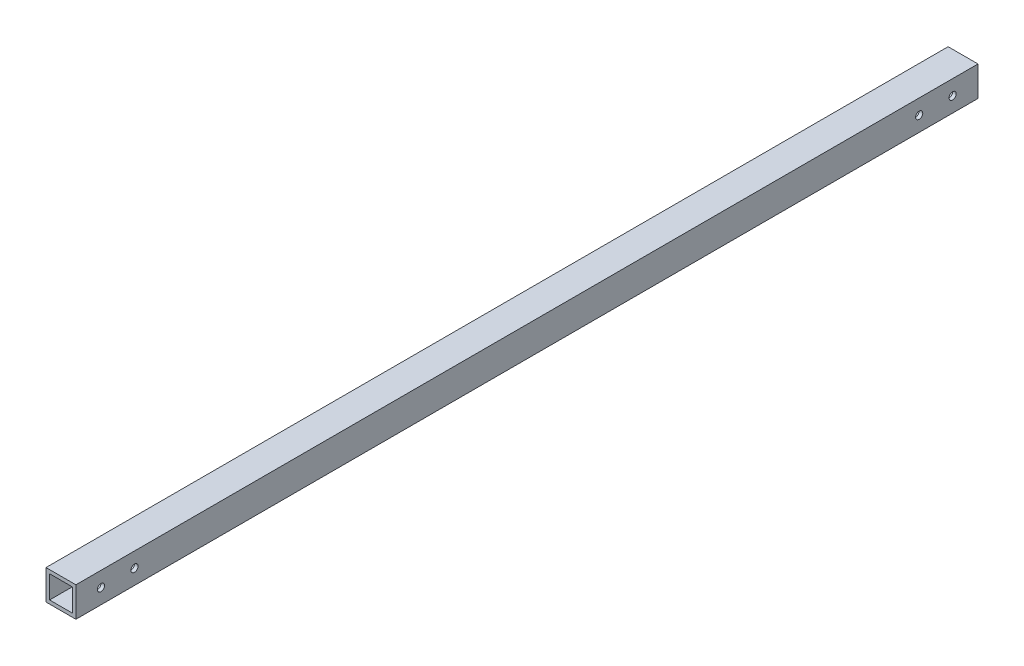
ISO-10303-21;
HEADER;
FILE_DESCRIPTION(('STEP AP214'),'2;1');
FILE_NAME('part.step','',(''),(''),'','','');
FILE_SCHEMA(('AUTOMOTIVE_DESIGN { 1 0 10303 214 1 1 1 1 }'));
ENDSEC;
DATA;
#1=APPLICATION_CONTEXT('core data for automotive mechanical design processes');
#2=APPLICATION_PROTOCOL_DEFINITION('international standard','automotive_design',2000,#1);
#3=PRODUCT_CONTEXT('',#1,'mechanical');
#4=PRODUCT('Part','Part','',(#3));
#5=PRODUCT_RELATED_PRODUCT_CATEGORY('part','',(#4));
#6=PRODUCT_DEFINITION_FORMATION('','',#4);
#7=PRODUCT_DEFINITION_CONTEXT('part definition',#1,'design');
#8=PRODUCT_DEFINITION('design','',#6,#7);
#9=PRODUCT_DEFINITION_SHAPE('','',#8);
#10=(LENGTH_UNIT() NAMED_UNIT(*) SI_UNIT(.MILLI.,.METRE.));
#11=(NAMED_UNIT(*) PLANE_ANGLE_UNIT() SI_UNIT($,.RADIAN.));
#12=(NAMED_UNIT(*) SI_UNIT($,.STERADIAN.) SOLID_ANGLE_UNIT());
#13=UNCERTAINTY_MEASURE_WITH_UNIT(LENGTH_MEASURE(1.E-05),#10,'distance_accuracy_value','');
#14=(GEOMETRIC_REPRESENTATION_CONTEXT(3) GLOBAL_UNCERTAINTY_ASSIGNED_CONTEXT((#13)) GLOBAL_UNIT_ASSIGNED_CONTEXT((#10,
#11,#12)) REPRESENTATION_CONTEXT('',''));
#15=CARTESIAN_POINT('',(0.,0.,0.));
#16=DIRECTION('',(0.,0.,1.));
#17=DIRECTION('',(1.,0.,0.));
#18=AXIS2_PLACEMENT_3D('',#15,#16,#17);
#19=CARTESIAN_POINT('',(0.,-25.,754.5));
#20=DIRECTION('',(0.,0.,1.));
#21=DIRECTION('',(1.,0.,0.));
#22=AXIS2_PLACEMENT_3D('',#19,#20,#21);
#23=PLANE('',#22);
#24=DIRECTION('',(0.,-1.,0.));
#25=VECTOR('',#24,1.);
#26=CARTESIAN_POINT('',(0.,0.,754.5));
#27=LINE('',#26,#25);
#28=CARTESIAN_POINT('',(0.,0.,754.5));
#29=VERTEX_POINT('',#28);
#30=CARTESIAN_POINT('',(0.,-25.,754.5));
#31=VERTEX_POINT('',#30);
#32=EDGE_CURVE('E137',#29,#31,#27,.T.);
#33=ORIENTED_EDGE('',*,*,#32,.T.);
#34=DIRECTION('',(1.,0.,0.));
#35=VECTOR('',#34,1.);
#36=CARTESIAN_POINT('',(0.,-25.,754.5));
#37=LINE('',#36,#35);
#38=CARTESIAN_POINT('',(25.,-25.,754.5));
#39=VERTEX_POINT('',#38);
#40=EDGE_CURVE('E140',#31,#39,#37,.T.);
#41=ORIENTED_EDGE('',*,*,#40,.T.);
#42=DIRECTION('',(0.,1.,0.));
#43=VECTOR('',#42,1.);
#44=CARTESIAN_POINT('',(25.,0.,754.5));
#45=LINE('',#44,#43);
#46=CARTESIAN_POINT('',(25.,0.,754.5));
#47=VERTEX_POINT('',#46);
#48=EDGE_CURVE('E143',#39,#47,#45,.T.);
#49=ORIENTED_EDGE('',*,*,#48,.T.);
#50=DIRECTION('',(-1.,0.,0.));
#51=VECTOR('',#50,1.);
#52=CARTESIAN_POINT('',(0.,0.,754.5));
#53=LINE('',#52,#51);
#54=EDGE_CURVE('E145',#47,#29,#53,.T.);
#55=ORIENTED_EDGE('',*,*,#54,.T.);
#56=EDGE_LOOP('',(#33,#41,#49,#55));
#57=FACE_BOUND('',#56,.T.);
#58=DIRECTION('',(1.,0.,0.));
#59=VECTOR('',#58,1.);
#60=CARTESIAN_POINT('',(3.,-22.,754.5));
#61=LINE('',#60,#59);
#62=CARTESIAN_POINT('',(3.,-22.,754.5));
#63=VERTEX_POINT('',#62);
#64=CARTESIAN_POINT('',(22.,-22.,754.5));
#65=VERTEX_POINT('',#64);
#66=EDGE_CURVE('E107',#63,#65,#61,.T.);
#67=ORIENTED_EDGE('',*,*,#66,.F.);
#68=DIRECTION('',(0.,-1.,0.));
#69=VECTOR('',#68,1.);
#70=CARTESIAN_POINT('',(3.,-3.,754.5));
#71=LINE('',#70,#69);
#72=CARTESIAN_POINT('',(3.,-3.,754.5));
#73=VERTEX_POINT('',#72);
#74=EDGE_CURVE('E99',#73,#63,#71,.T.);
#75=ORIENTED_EDGE('',*,*,#74,.F.);
#76=DIRECTION('',(-1.,0.,0.));
#77=VECTOR('',#76,1.);
#78=CARTESIAN_POINT('',(3.,-3.,754.5));
#79=LINE('',#78,#77);
#80=CARTESIAN_POINT('',(22.,-3.,754.5));
#81=VERTEX_POINT('',#80);
#82=EDGE_CURVE('E121',#81,#73,#79,.T.);
#83=ORIENTED_EDGE('',*,*,#82,.F.);
#84=DIRECTION('',(0.,1.,0.));
#85=VECTOR('',#84,1.);
#86=CARTESIAN_POINT('',(22.,-3.,754.5));
#87=LINE('',#86,#85);
#88=EDGE_CURVE('E119',#65,#81,#87,.T.);
#89=ORIENTED_EDGE('',*,*,#88,.F.);
#90=EDGE_LOOP('',(#67,#75,#83,#89));
#91=FACE_BOUND('',#90,.T.);
#92=ADVANCED_FACE('F32',(#57,#91),#23,.T.);
#93=CARTESIAN_POINT('',(0.,-25.,0.));
#94=DIRECTION('',(0.,0.,1.));
#95=DIRECTION('',(1.,0.,0.));
#96=AXIS2_PLACEMENT_3D('',#93,#94,#95);
#97=PLANE('',#96);
#98=DIRECTION('',(0.,-1.,0.));
#99=VECTOR('',#98,1.);
#100=CARTESIAN_POINT('',(0.,0.,0.));
#101=LINE('',#100,#99);
#102=CARTESIAN_POINT('',(0.,0.,0.));
#103=VERTEX_POINT('',#102);
#104=CARTESIAN_POINT('',(0.,-25.,0.));
#105=VERTEX_POINT('',#104);
#106=EDGE_CURVE('E115',#103,#105,#101,.T.);
#107=ORIENTED_EDGE('',*,*,#106,.F.);
#108=DIRECTION('',(-1.,0.,0.));
#109=VECTOR('',#108,1.);
#110=CARTESIAN_POINT('',(0.,0.,0.));
#111=LINE('',#110,#109);
#112=CARTESIAN_POINT('',(25.,0.,0.));
#113=VERTEX_POINT('',#112);
#114=EDGE_CURVE('E141',#113,#103,#111,.T.);
#115=ORIENTED_EDGE('',*,*,#114,.F.);
#116=DIRECTION('',(0.,1.,0.));
#117=VECTOR('',#116,1.);
#118=CARTESIAN_POINT('',(25.,0.,0.));
#119=LINE('',#118,#117);
#120=CARTESIAN_POINT('',(25.,-25.,0.));
#121=VERTEX_POINT('',#120);
#122=EDGE_CURVE('E152',#121,#113,#119,.T.);
#123=ORIENTED_EDGE('',*,*,#122,.F.);
#124=DIRECTION('',(1.,0.,0.));
#125=VECTOR('',#124,1.);
#126=CARTESIAN_POINT('',(0.,-25.,0.));
#127=LINE('',#126,#125);
#128=EDGE_CURVE('E150',#105,#121,#127,.T.);
#129=ORIENTED_EDGE('',*,*,#128,.F.);
#130=EDGE_LOOP('',(#107,#115,#123,#129));
#131=FACE_BOUND('',#130,.T.);
#132=DIRECTION('',(0.,-1.,0.));
#133=VECTOR('',#132,1.);
#134=CARTESIAN_POINT('',(3.,-3.,0.));
#135=LINE('',#134,#133);
#136=CARTESIAN_POINT('',(3.,-3.,0.));
#137=VERTEX_POINT('',#136);
#138=CARTESIAN_POINT('',(3.,-22.,0.));
#139=VERTEX_POINT('',#138);
#140=EDGE_CURVE('E57',#137,#139,#135,.T.);
#141=ORIENTED_EDGE('',*,*,#140,.T.);
#142=DIRECTION('',(1.,0.,0.));
#143=VECTOR('',#142,1.);
#144=CARTESIAN_POINT('',(3.,-22.,0.));
#145=LINE('',#144,#143);
#146=CARTESIAN_POINT('',(22.,-22.,0.));
#147=VERTEX_POINT('',#146);
#148=EDGE_CURVE('E114',#139,#147,#145,.T.);
#149=ORIENTED_EDGE('',*,*,#148,.T.);
#150=DIRECTION('',(0.,1.,0.));
#151=VECTOR('',#150,1.);
#152=CARTESIAN_POINT('',(22.,-3.,0.));
#153=LINE('',#152,#151);
#154=CARTESIAN_POINT('',(22.,-3.,0.));
#155=VERTEX_POINT('',#154);
#156=EDGE_CURVE('E129',#147,#155,#153,.T.);
#157=ORIENTED_EDGE('',*,*,#156,.T.);
#158=DIRECTION('',(-1.,0.,0.));
#159=VECTOR('',#158,1.);
#160=CARTESIAN_POINT('',(3.,-3.,0.));
#161=LINE('',#160,#159);
#162=EDGE_CURVE('E108',#155,#137,#161,.T.);
#163=ORIENTED_EDGE('',*,*,#162,.T.);
#164=EDGE_LOOP('',(#141,#149,#157,#163));
#165=FACE_BOUND('',#164,.T.);
#166=ADVANCED_FACE('F222',(#131,#165),#97,.F.);
#167=CARTESIAN_POINT('',(0.,0.,754.5));
#168=DIRECTION('',(1.,0.,0.));
#169=DIRECTION('',(0.,1.,0.));
#170=AXIS2_PLACEMENT_3D('',#167,#168,#169);
#171=PLANE('',#170);
#172=CARTESIAN_POINT('',(0.,-12.5,49.2));
#173=DIRECTION('',(-1.,0.,0.));
#174=DIRECTION('',(0.,-1.,0.));
#175=AXIS2_PLACEMENT_3D('',#172,#173,#174);
#176=CIRCLE('',#175,5.99999999999999);
#177=CARTESIAN_POINT('',(0.,-18.5,49.2));
#178=VERTEX_POINT('',#177);
#179=EDGE_CURVE('E203',#178,#178,#176,.T.);
#180=ORIENTED_EDGE('',*,*,#179,.F.);
#181=EDGE_LOOP('',(#180));
#182=FACE_BOUND('',#181,.T.);
#183=CARTESIAN_POINT('',(0.,-12.5,21.2));
#184=DIRECTION('',(-1.,0.,0.));
#185=DIRECTION('',(0.,-1.,0.));
#186=AXIS2_PLACEMENT_3D('',#183,#184,#185);
#187=CIRCLE('',#186,5.99999999999999);
#188=CARTESIAN_POINT('',(0.,-18.5,21.2));
#189=VERTEX_POINT('',#188);
#190=EDGE_CURVE('E197',#189,#189,#187,.T.);
#191=ORIENTED_EDGE('',*,*,#190,.F.);
#192=EDGE_LOOP('',(#191));
#193=FACE_BOUND('',#192,.T.);
#194=CARTESIAN_POINT('',(0.,-12.5,733.5));
#195=DIRECTION('',(-1.,0.,0.));
#196=DIRECTION('',(0.,-1.,0.));
#197=AXIS2_PLACEMENT_3D('',#194,#195,#196);
#198=CIRCLE('',#197,5.99999999999999);
#199=CARTESIAN_POINT('',(0.,-18.5,733.5));
#200=VERTEX_POINT('',#199);
#201=EDGE_CURVE('E177',#200,#200,#198,.T.);
#202=ORIENTED_EDGE('',*,*,#201,.F.);
#203=EDGE_LOOP('',(#202));
#204=FACE_BOUND('',#203,.T.);
#205=CARTESIAN_POINT('',(0.,-12.5,705.5));
#206=DIRECTION('',(-1.,0.,0.));
#207=DIRECTION('',(0.,-1.,0.));
#208=AXIS2_PLACEMENT_3D('',#205,#206,#207);
#209=CIRCLE('',#208,5.99999999999999);
#210=CARTESIAN_POINT('',(0.,-18.5,705.5));
#211=VERTEX_POINT('',#210);
#212=EDGE_CURVE('E173',#211,#211,#209,.T.);
#213=ORIENTED_EDGE('',*,*,#212,.F.);
#214=EDGE_LOOP('',(#213));
#215=FACE_BOUND('',#214,.T.);
#216=ORIENTED_EDGE('',*,*,#106,.T.);
#217=DIRECTION('',(0.,0.,-1.));
#218=VECTOR('',#217,1.);
#219=CARTESIAN_POINT('',(0.,-25.,754.5));
#220=LINE('',#219,#218);
#221=EDGE_CURVE('E11',#31,#105,#220,.T.);
#222=ORIENTED_EDGE('',*,*,#221,.F.);
#223=ORIENTED_EDGE('',*,*,#32,.F.);
#224=DIRECTION('',(0.,0.,-1.));
#225=VECTOR('',#224,1.);
#226=CARTESIAN_POINT('',(0.,0.,754.5));
#227=LINE('',#226,#225);
#228=EDGE_CURVE('E147',#29,#103,#227,.T.);
#229=ORIENTED_EDGE('',*,*,#228,.T.);
#230=EDGE_LOOP('',(#216,#222,#223,#229));
#231=FACE_BOUND('',#230,.T.);
#232=ADVANCED_FACE('F34',(#182,#193,#204,#215,#231),#171,.F.);
#233=CARTESIAN_POINT('',(0.,-25.,754.5));
#234=DIRECTION('',(0.,1.,0.));
#235=DIRECTION('',(0.,0.,1.));
#236=AXIS2_PLACEMENT_3D('',#233,#234,#235);
#237=PLANE('',#236);
#238=ORIENTED_EDGE('',*,*,#128,.T.);
#239=DIRECTION('',(0.,0.,-1.));
#240=VECTOR('',#239,1.);
#241=CARTESIAN_POINT('',(25.,-25.,754.5));
#242=LINE('',#241,#240);
#243=EDGE_CURVE('E41',#39,#121,#242,.T.);
#244=ORIENTED_EDGE('',*,*,#243,.F.);
#245=ORIENTED_EDGE('',*,*,#40,.F.);
#246=ORIENTED_EDGE('',*,*,#221,.T.);
#247=EDGE_LOOP('',(#238,#244,#245,#246));
#248=FACE_BOUND('',#247,.T.);
#249=ADVANCED_FACE('F221',(#248),#237,.F.);
#250=CARTESIAN_POINT('',(25.,0.,754.5));
#251=DIRECTION('',(-1.,0.,0.));
#252=DIRECTION('',(0.,-1.,0.));
#253=AXIS2_PLACEMENT_3D('',#250,#251,#252);
#254=PLANE('',#253);
#255=CARTESIAN_POINT('',(25.,-12.5,49.2));
#256=DIRECTION('',(1.,0.,0.));
#257=DIRECTION('',(0.,0.,-1.));
#258=AXIS2_PLACEMENT_3D('',#255,#256,#257);
#259=CIRCLE('',#258,2.99999999999999);
#260=CARTESIAN_POINT('',(25.,-12.5,46.2));
#261=VERTEX_POINT('',#260);
#262=EDGE_CURVE('E191',#261,#261,#259,.T.);
#263=ORIENTED_EDGE('',*,*,#262,.F.);
#264=EDGE_LOOP('',(#263));
#265=FACE_BOUND('',#264,.T.);
#266=CARTESIAN_POINT('',(25.,-12.5,21.2));
#267=DIRECTION('',(1.,0.,0.));
#268=DIRECTION('',(0.,0.,-1.));
#269=AXIS2_PLACEMENT_3D('',#266,#267,#268);
#270=CIRCLE('',#269,2.99999999999999);
#271=CARTESIAN_POINT('',(25.,-12.5,18.2));
#272=VERTEX_POINT('',#271);
#273=EDGE_CURVE('E183',#272,#272,#270,.T.);
#274=ORIENTED_EDGE('',*,*,#273,.F.);
#275=EDGE_LOOP('',(#274));
#276=FACE_BOUND('',#275,.T.);
#277=CARTESIAN_POINT('',(25.,-12.5,705.5));
#278=DIRECTION('',(1.,0.,0.));
#279=DIRECTION('',(0.,0.,-1.));
#280=AXIS2_PLACEMENT_3D('',#277,#278,#279);
#281=CIRCLE('',#280,2.99999999999999);
#282=CARTESIAN_POINT('',(25.,-12.5,702.5));
#283=VERTEX_POINT('',#282);
#284=EDGE_CURVE('E169',#283,#283,#281,.T.);
#285=ORIENTED_EDGE('',*,*,#284,.F.);
#286=EDGE_LOOP('',(#285));
#287=FACE_BOUND('',#286,.T.);
#288=CARTESIAN_POINT('',(25.,-12.5,733.5));
#289=DIRECTION('',(1.,0.,0.));
#290=DIRECTION('',(0.,0.,-1.));
#291=AXIS2_PLACEMENT_3D('',#288,#289,#290);
#292=CIRCLE('',#291,2.99999999999999);
#293=CARTESIAN_POINT('',(25.,-12.5,730.5));
#294=VERTEX_POINT('',#293);
#295=EDGE_CURVE('E162',#294,#294,#292,.T.);
#296=ORIENTED_EDGE('',*,*,#295,.F.);
#297=EDGE_LOOP('',(#296));
#298=FACE_BOUND('',#297,.T.);
#299=ORIENTED_EDGE('',*,*,#122,.T.);
#300=DIRECTION('',(0.,0.,-1.));
#301=VECTOR('',#300,1.);
#302=CARTESIAN_POINT('',(25.,0.,754.5));
#303=LINE('',#302,#301);
#304=EDGE_CURVE('E157',#47,#113,#303,.T.);
#305=ORIENTED_EDGE('',*,*,#304,.F.);
#306=ORIENTED_EDGE('',*,*,#48,.F.);
#307=ORIENTED_EDGE('',*,*,#243,.T.);
#308=EDGE_LOOP('',(#299,#305,#306,#307));
#309=FACE_BOUND('',#308,.T.);
#310=ADVANCED_FACE('F246',(#265,#276,#287,#298,#309),#254,.F.);
#311=CARTESIAN_POINT('',(0.,0.,754.5));
#312=DIRECTION('',(0.,-1.,0.));
#313=DIRECTION('',(0.,0.,-1.));
#314=AXIS2_PLACEMENT_3D('',#311,#312,#313);
#315=PLANE('',#314);
#316=ORIENTED_EDGE('',*,*,#114,.T.);
#317=ORIENTED_EDGE('',*,*,#228,.F.);
#318=ORIENTED_EDGE('',*,*,#54,.F.);
#319=ORIENTED_EDGE('',*,*,#304,.T.);
#320=EDGE_LOOP('',(#316,#317,#318,#319));
#321=FACE_BOUND('',#320,.T.);
#322=ADVANCED_FACE('F244',(#321),#315,.F.);
#323=CARTESIAN_POINT('',(3.,-3.,754.5));
#324=DIRECTION('',(1.,0.,0.));
#325=DIRECTION('',(0.,1.,0.));
#326=AXIS2_PLACEMENT_3D('',#323,#324,#325);
#327=PLANE('',#326);
#328=CARTESIAN_POINT('',(3.,-12.5,49.2));
#329=DIRECTION('',(1.,0.,0.));
#330=DIRECTION('',(0.,1.,0.));
#331=AXIS2_PLACEMENT_3D('',#328,#329,#330);
#332=CIRCLE('',#331,5.99999999999999);
#333=CARTESIAN_POINT('',(3.,-6.50000000000001,49.2));
#334=VERTEX_POINT('',#333);
#335=EDGE_CURVE('E206',#334,#334,#332,.F.);
#336=ORIENTED_EDGE('',*,*,#335,.T.);
#337=EDGE_LOOP('',(#336));
#338=FACE_BOUND('',#337,.T.);
#339=CARTESIAN_POINT('',(3.,-12.5,21.2));
#340=DIRECTION('',(1.,0.,0.));
#341=DIRECTION('',(0.,1.,0.));
#342=AXIS2_PLACEMENT_3D('',#339,#340,#341);
#343=CIRCLE('',#342,5.99999999999999);
#344=CARTESIAN_POINT('',(3.,-6.50000000000001,21.2));
#345=VERTEX_POINT('',#344);
#346=EDGE_CURVE('E200',#345,#345,#343,.F.);
#347=ORIENTED_EDGE('',*,*,#346,.T.);
#348=EDGE_LOOP('',(#347));
#349=FACE_BOUND('',#348,.T.);
#350=CARTESIAN_POINT('',(3.,-12.5,733.5));
#351=DIRECTION('',(1.,0.,0.));
#352=DIRECTION('',(0.,1.,0.));
#353=AXIS2_PLACEMENT_3D('',#350,#351,#352);
#354=CIRCLE('',#353,5.99999999999999);
#355=CARTESIAN_POINT('',(3.,-6.50000000000001,733.5));
#356=VERTEX_POINT('',#355);
#357=EDGE_CURVE('E180',#356,#356,#354,.F.);
#358=ORIENTED_EDGE('',*,*,#357,.T.);
#359=EDGE_LOOP('',(#358));
#360=FACE_BOUND('',#359,.T.);
#361=CARTESIAN_POINT('',(3.,-12.5,705.5));
#362=DIRECTION('',(1.,0.,0.));
#363=DIRECTION('',(0.,1.,0.));
#364=AXIS2_PLACEMENT_3D('',#361,#362,#363);
#365=CIRCLE('',#364,5.99999999999999);
#366=CARTESIAN_POINT('',(3.,-6.50000000000001,705.5));
#367=VERTEX_POINT('',#366);
#368=EDGE_CURVE('E174',#367,#367,#365,.F.);
#369=ORIENTED_EDGE('',*,*,#368,.T.);
#370=EDGE_LOOP('',(#369));
#371=FACE_BOUND('',#370,.T.);
#372=ORIENTED_EDGE('',*,*,#140,.F.);
#373=DIRECTION('',(0.,0.,-1.));
#374=VECTOR('',#373,1.);
#375=CARTESIAN_POINT('',(3.,-3.,754.5));
#376=LINE('',#375,#374);
#377=EDGE_CURVE('E103',#73,#137,#376,.T.);
#378=ORIENTED_EDGE('',*,*,#377,.F.);
#379=ORIENTED_EDGE('',*,*,#74,.T.);
#380=DIRECTION('',(0.,0.,-1.));
#381=VECTOR('',#380,1.);
#382=CARTESIAN_POINT('',(3.,-22.,754.5));
#383=LINE('',#382,#381);
#384=EDGE_CURVE('E102',#63,#139,#383,.T.);
#385=ORIENTED_EDGE('',*,*,#384,.T.);
#386=EDGE_LOOP('',(#372,#378,#379,#385));
#387=FACE_BOUND('',#386,.T.);
#388=ADVANCED_FACE('F101',(#338,#349,#360,#371,#387),#327,.T.);
#389=CARTESIAN_POINT('',(3.,-22.,754.5));
#390=DIRECTION('',(0.,1.,0.));
#391=DIRECTION('',(0.,0.,1.));
#392=AXIS2_PLACEMENT_3D('',#389,#390,#391);
#393=PLANE('',#392);
#394=ORIENTED_EDGE('',*,*,#148,.F.);
#395=ORIENTED_EDGE('',*,*,#384,.F.);
#396=ORIENTED_EDGE('',*,*,#66,.T.);
#397=DIRECTION('',(0.,0.,-1.));
#398=VECTOR('',#397,1.);
#399=CARTESIAN_POINT('',(22.,-22.,754.5));
#400=LINE('',#399,#398);
#401=EDGE_CURVE('E116',#65,#147,#400,.T.);
#402=ORIENTED_EDGE('',*,*,#401,.T.);
#403=EDGE_LOOP('',(#394,#395,#396,#402));
#404=FACE_BOUND('',#403,.T.);
#405=ADVANCED_FACE('F111',(#404),#393,.T.);
#406=CARTESIAN_POINT('',(22.,-3.,754.5));
#407=DIRECTION('',(-1.,0.,0.));
#408=DIRECTION('',(0.,-1.,0.));
#409=AXIS2_PLACEMENT_3D('',#406,#407,#408);
#410=PLANE('',#409);
#411=CARTESIAN_POINT('',(22.,-12.5,49.2));
#412=DIRECTION('',(-1.,0.,0.));
#413=DIRECTION('',(0.,-1.,0.));
#414=AXIS2_PLACEMENT_3D('',#411,#412,#413);
#415=CIRCLE('',#414,2.99999999999999);
#416=CARTESIAN_POINT('',(22.,-15.5,49.2));
#417=VERTEX_POINT('',#416);
#418=EDGE_CURVE('E194',#417,#417,#415,.T.);
#419=ORIENTED_EDGE('',*,*,#418,.F.);
#420=EDGE_LOOP('',(#419));
#421=FACE_BOUND('',#420,.T.);
#422=CARTESIAN_POINT('',(22.,-12.5,21.2));
#423=DIRECTION('',(-1.,0.,0.));
#424=DIRECTION('',(0.,-1.,0.));
#425=AXIS2_PLACEMENT_3D('',#422,#423,#424);
#426=CIRCLE('',#425,2.99999999999999);
#427=CARTESIAN_POINT('',(22.,-15.5,21.2));
#428=VERTEX_POINT('',#427);
#429=EDGE_CURVE('E188',#428,#428,#426,.T.);
#430=ORIENTED_EDGE('',*,*,#429,.F.);
#431=EDGE_LOOP('',(#430));
#432=FACE_BOUND('',#431,.T.);
#433=CARTESIAN_POINT('',(22.,-12.5,705.5));
#434=DIRECTION('',(-1.,0.,0.));
#435=DIRECTION('',(0.,-1.,0.));
#436=AXIS2_PLACEMENT_3D('',#433,#434,#435);
#437=CIRCLE('',#436,2.99999999999999);
#438=CARTESIAN_POINT('',(22.,-15.5,705.5));
#439=VERTEX_POINT('',#438);
#440=EDGE_CURVE('E36',#439,#439,#437,.T.);
#441=ORIENTED_EDGE('',*,*,#440,.F.);
#442=EDGE_LOOP('',(#441));
#443=FACE_BOUND('',#442,.T.);
#444=CARTESIAN_POINT('',(22.,-12.5,733.5));
#445=DIRECTION('',(-1.,0.,0.));
#446=DIRECTION('',(0.,-1.,0.));
#447=AXIS2_PLACEMENT_3D('',#444,#445,#446);
#448=CIRCLE('',#447,2.99999999999999);
#449=CARTESIAN_POINT('',(22.,-15.5,733.5));
#450=VERTEX_POINT('',#449);
#451=EDGE_CURVE('E127',#450,#450,#448,.T.);
#452=ORIENTED_EDGE('',*,*,#451,.F.);
#453=EDGE_LOOP('',(#452));
#454=FACE_BOUND('',#453,.T.);
#455=ORIENTED_EDGE('',*,*,#156,.F.);
#456=ORIENTED_EDGE('',*,*,#401,.F.);
#457=ORIENTED_EDGE('',*,*,#88,.T.);
#458=DIRECTION('',(0.,0.,-1.));
#459=VECTOR('',#458,1.);
#460=CARTESIAN_POINT('',(22.,-3.,754.5));
#461=LINE('',#460,#459);
#462=EDGE_CURVE('E49',#81,#155,#461,.T.);
#463=ORIENTED_EDGE('',*,*,#462,.T.);
#464=EDGE_LOOP('',(#455,#456,#457,#463));
#465=FACE_BOUND('',#464,.T.);
#466=ADVANCED_FACE('F268',(#421,#432,#443,#454,#465),#410,.T.);
#467=CARTESIAN_POINT('',(3.,-3.,754.5));
#468=DIRECTION('',(0.,-1.,0.));
#469=DIRECTION('',(0.,0.,-1.));
#470=AXIS2_PLACEMENT_3D('',#467,#468,#469);
#471=PLANE('',#470);
#472=ORIENTED_EDGE('',*,*,#162,.F.);
#473=ORIENTED_EDGE('',*,*,#462,.F.);
#474=ORIENTED_EDGE('',*,*,#82,.T.);
#475=ORIENTED_EDGE('',*,*,#377,.T.);
#476=EDGE_LOOP('',(#472,#473,#474,#475));
#477=FACE_BOUND('',#476,.T.);
#478=ADVANCED_FACE('F271',(#477),#471,.T.);
#479=CARTESIAN_POINT('',(25.,-12.5,733.5));
#480=DIRECTION('',(1.,0.,0.));
#481=DIRECTION('',(0.,0.,-1.));
#482=AXIS2_PLACEMENT_3D('',#479,#480,#481);
#483=CYLINDRICAL_SURFACE('',#482,2.99999999999999);
#484=ORIENTED_EDGE('',*,*,#451,.T.);
#485=EDGE_LOOP('',(#484));
#486=FACE_BOUND('',#485,.T.);
#487=ORIENTED_EDGE('',*,*,#295,.T.);
#488=EDGE_LOOP('',(#487));
#489=FACE_BOUND('',#488,.T.);
#490=ADVANCED_FACE('F275',(#486,#489),#483,.F.);
#491=CARTESIAN_POINT('',(25.,-12.5,705.5));
#492=DIRECTION('',(1.,0.,0.));
#493=DIRECTION('',(0.,0.,-1.));
#494=AXIS2_PLACEMENT_3D('',#491,#492,#493);
#495=CYLINDRICAL_SURFACE('',#494,2.99999999999999);
#496=ORIENTED_EDGE('',*,*,#440,.T.);
#497=EDGE_LOOP('',(#496));
#498=FACE_BOUND('',#497,.T.);
#499=ORIENTED_EDGE('',*,*,#284,.T.);
#500=EDGE_LOOP('',(#499));
#501=FACE_BOUND('',#500,.T.);
#502=ADVANCED_FACE('F278',(#498,#501),#495,.F.);
#503=CARTESIAN_POINT('',(25.001,-12.5,705.5));
#504=DIRECTION('',(-1.,0.,0.));
#505=DIRECTION('',(0.,-1.,0.));
#506=AXIS2_PLACEMENT_3D('',#503,#504,#505);
#507=CYLINDRICAL_SURFACE('',#506,5.99999999999999);
#508=ORIENTED_EDGE('',*,*,#368,.F.);
#509=EDGE_LOOP('',(#508));
#510=FACE_BOUND('',#509,.T.);
#511=ORIENTED_EDGE('',*,*,#212,.T.);
#512=EDGE_LOOP('',(#511));
#513=FACE_BOUND('',#512,.T.);
#514=ADVANCED_FACE('F281',(#510,#513),#507,.F.);
#515=CARTESIAN_POINT('',(25.001,-12.5,733.5));
#516=DIRECTION('',(-1.,0.,0.));
#517=DIRECTION('',(0.,-1.,0.));
#518=AXIS2_PLACEMENT_3D('',#515,#516,#517);
#519=CYLINDRICAL_SURFACE('',#518,5.99999999999999);
#520=ORIENTED_EDGE('',*,*,#357,.F.);
#521=EDGE_LOOP('',(#520));
#522=FACE_BOUND('',#521,.T.);
#523=ORIENTED_EDGE('',*,*,#201,.T.);
#524=EDGE_LOOP('',(#523));
#525=FACE_BOUND('',#524,.T.);
#526=ADVANCED_FACE('F285',(#522,#525),#519,.F.);
#527=CARTESIAN_POINT('',(25.,-12.5,21.2));
#528=DIRECTION('',(1.,0.,0.));
#529=DIRECTION('',(0.,0.,-1.));
#530=AXIS2_PLACEMENT_3D('',#527,#528,#529);
#531=CYLINDRICAL_SURFACE('',#530,2.99999999999999);
#532=ORIENTED_EDGE('',*,*,#429,.T.);
#533=EDGE_LOOP('',(#532));
#534=FACE_BOUND('',#533,.T.);
#535=ORIENTED_EDGE('',*,*,#273,.T.);
#536=EDGE_LOOP('',(#535));
#537=FACE_BOUND('',#536,.T.);
#538=ADVANCED_FACE('F289',(#534,#537),#531,.F.);
#539=CARTESIAN_POINT('',(25.,-12.5,49.2));
#540=DIRECTION('',(1.,0.,0.));
#541=DIRECTION('',(0.,0.,-1.));
#542=AXIS2_PLACEMENT_3D('',#539,#540,#541);
#543=CYLINDRICAL_SURFACE('',#542,2.99999999999999);
#544=ORIENTED_EDGE('',*,*,#418,.T.);
#545=EDGE_LOOP('',(#544));
#546=FACE_BOUND('',#545,.T.);
#547=ORIENTED_EDGE('',*,*,#262,.T.);
#548=EDGE_LOOP('',(#547));
#549=FACE_BOUND('',#548,.T.);
#550=ADVANCED_FACE('F293',(#546,#549),#543,.F.);
#551=CARTESIAN_POINT('',(25.001,-12.5,21.2));
#552=DIRECTION('',(-1.,0.,0.));
#553=DIRECTION('',(0.,-1.,0.));
#554=AXIS2_PLACEMENT_3D('',#551,#552,#553);
#555=CYLINDRICAL_SURFACE('',#554,5.99999999999999);
#556=ORIENTED_EDGE('',*,*,#346,.F.);
#557=EDGE_LOOP('',(#556));
#558=FACE_BOUND('',#557,.T.);
#559=ORIENTED_EDGE('',*,*,#190,.T.);
#560=EDGE_LOOP('',(#559));
#561=FACE_BOUND('',#560,.T.);
#562=ADVANCED_FACE('F215',(#558,#561),#555,.F.);
#563=CARTESIAN_POINT('',(25.001,-12.5,49.2));
#564=DIRECTION('',(-1.,0.,0.));
#565=DIRECTION('',(0.,-1.,0.));
#566=AXIS2_PLACEMENT_3D('',#563,#564,#565);
#567=CYLINDRICAL_SURFACE('',#566,5.99999999999999);
#568=ORIENTED_EDGE('',*,*,#335,.F.);
#569=EDGE_LOOP('',(#568));
#570=FACE_BOUND('',#569,.T.);
#571=ORIENTED_EDGE('',*,*,#179,.T.);
#572=EDGE_LOOP('',(#571));
#573=FACE_BOUND('',#572,.T.);
#574=ADVANCED_FACE('F212',(#570,#573),#567,.F.);
#575=CLOSED_SHELL('',(#92,#166,#232,#249,#310,#322,#388,#405,#466,#478,#490,#502,#514,#526,#538,
#550,#562,#574));
#576=MANIFOLD_SOLID_BREP('B2',#575);
#577=ADVANCED_BREP_SHAPE_REPRESENTATION('',(#18,#576),#14);
#578=SHAPE_DEFINITION_REPRESENTATION(#9,#577);
ENDSEC;
END-ISO-10303-21;
